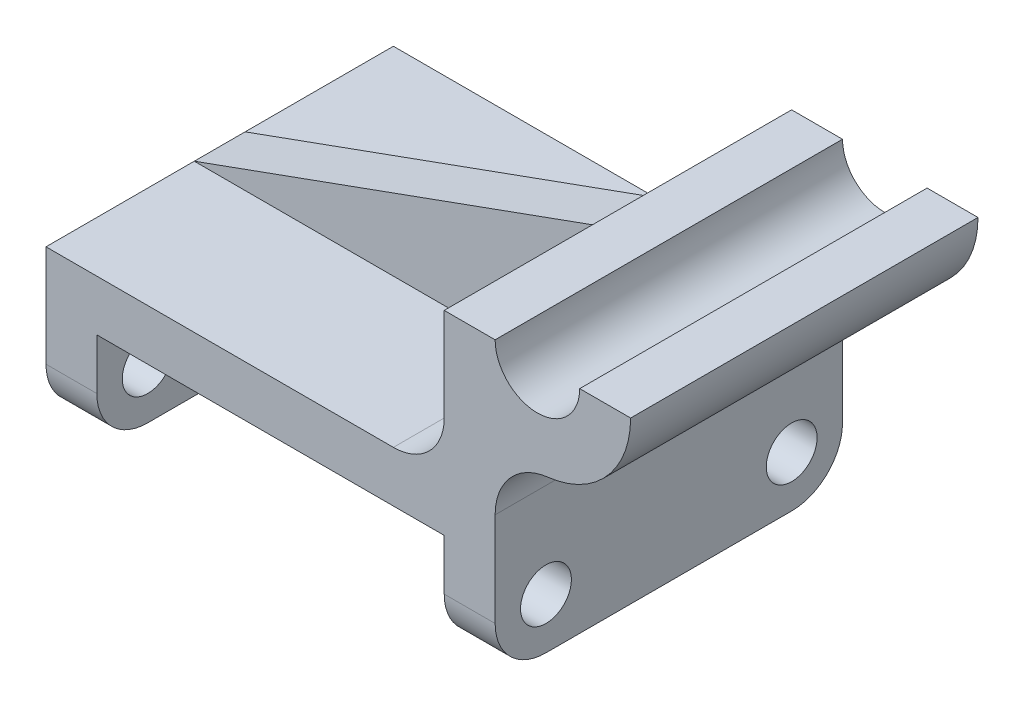
ISO-10303-21;
HEADER;
FILE_DESCRIPTION(('STEP AP214'),'2;1');
FILE_NAME('part.step','',(''),(''),'','','');
FILE_SCHEMA(('AUTOMOTIVE_DESIGN { 1 0 10303 214 1 1 1 1 }'));
ENDSEC;
DATA;
#1=APPLICATION_CONTEXT('core data for automotive mechanical design processes');
#2=APPLICATION_PROTOCOL_DEFINITION('international standard','automotive_design',2000,#1);
#3=PRODUCT_CONTEXT('',#1,'mechanical');
#4=PRODUCT('Part','Part','',(#3));
#5=PRODUCT_RELATED_PRODUCT_CATEGORY('part','',(#4));
#6=PRODUCT_DEFINITION_FORMATION('','',#4);
#7=PRODUCT_DEFINITION_CONTEXT('part definition',#1,'design');
#8=PRODUCT_DEFINITION('design','',#6,#7);
#9=PRODUCT_DEFINITION_SHAPE('','',#8);
#10=(LENGTH_UNIT() NAMED_UNIT(*) SI_UNIT(.MILLI.,.METRE.));
#11=(NAMED_UNIT(*) PLANE_ANGLE_UNIT() SI_UNIT($,.RADIAN.));
#12=(NAMED_UNIT(*) SI_UNIT($,.STERADIAN.) SOLID_ANGLE_UNIT());
#13=UNCERTAINTY_MEASURE_WITH_UNIT(LENGTH_MEASURE(1.E-05),#10,'distance_accuracy_value','');
#14=(GEOMETRIC_REPRESENTATION_CONTEXT(3) GLOBAL_UNCERTAINTY_ASSIGNED_CONTEXT((#13)) GLOBAL_UNIT_ASSIGNED_CONTEXT((#10,
#11,#12)) REPRESENTATION_CONTEXT('',''));
#15=CARTESIAN_POINT('',(0.,0.,0.));
#16=DIRECTION('',(0.,0.,1.));
#17=DIRECTION('',(1.,0.,0.));
#18=AXIS2_PLACEMENT_3D('',#15,#16,#17);
#19=CARTESIAN_POINT('',(15.7865860051617,7.16154123434295,82.));
#20=DIRECTION('',(1.,0.,0.));
#21=DIRECTION('',(0.,0.,-1.));
#22=AXIS2_PLACEMENT_3D('',#19,#20,#21);
#23=PLANE('',#22);
#24=DIRECTION('',(0.,1.,0.));
#25=VECTOR('',#24,1.);
#26=CARTESIAN_POINT('',(15.7865860051617,29.1615412343429,35.));
#27=LINE('',#26,#25);
#28=CARTESIAN_POINT('',(15.7865860051617,7.16154123434295,35.));
#29=VERTEX_POINT('',#28);
#30=CARTESIAN_POINT('',(15.7865860051617,29.1615412343429,35.));
#31=VERTEX_POINT('',#30);
#32=EDGE_CURVE('E417',#29,#31,#27,.T.);
#33=ORIENTED_EDGE('',*,*,#32,.T.);
#34=DIRECTION('',(0.,0.,-1.));
#35=VECTOR('',#34,1.);
#36=CARTESIAN_POINT('',(15.7865860051617,29.1615412343429,82.));
#37=LINE('',#36,#35);
#38=CARTESIAN_POINT('',(15.7865860051617,29.1615412343429,0.));
#39=VERTEX_POINT('',#38);
#40=EDGE_CURVE('E215',#31,#39,#37,.T.);
#41=ORIENTED_EDGE('',*,*,#40,.T.);
#42=DIRECTION('',(0.,-1.,0.));
#43=VECTOR('',#42,1.);
#44=CARTESIAN_POINT('',(15.7865860051617,7.16154123434295,0.));
#45=LINE('',#44,#43);
#46=CARTESIAN_POINT('',(15.7865860051617,7.16154123434295,0.));
#47=VERTEX_POINT('',#46);
#48=EDGE_CURVE('E367',#39,#47,#45,.T.);
#49=ORIENTED_EDGE('',*,*,#48,.T.);
#50=DIRECTION('',(0.,0.,-1.));
#51=VECTOR('',#50,1.);
#52=CARTESIAN_POINT('',(15.7865860051617,7.16154123434295,82.));
#53=LINE('',#52,#51);
#54=EDGE_CURVE('E216',#29,#47,#53,.T.);
#55=ORIENTED_EDGE('',*,*,#54,.F.);
#56=EDGE_LOOP('',(#33,#41,#49,#55));
#57=FACE_BOUND('',#56,.T.);
#58=ADVANCED_FACE('F37',(#57),#23,.F.);
#59=CARTESIAN_POINT('',(3.78658600516171,7.16154123434287,82.));
#60=DIRECTION('',(0.,0.,-1.));
#61=DIRECTION('',(-1.,0.,0.));
#62=AXIS2_PLACEMENT_3D('',#59,#60,#61);
#63=CYLINDRICAL_SURFACE('',#62,12.);
#64=CARTESIAN_POINT('',(3.78658600516171,7.16154123434287,35.));
#65=DIRECTION('',(0.,0.,1.));
#66=DIRECTION('',(1.,0.,0.));
#67=AXIS2_PLACEMENT_3D('',#64,#65,#66);
#68=CIRCLE('',#67,12.);
#69=CARTESIAN_POINT('',(3.78658600516163,-4.83845876565713,35.));
#70=VERTEX_POINT('',#69);
#71=EDGE_CURVE('E414',#70,#29,#68,.T.);
#72=ORIENTED_EDGE('',*,*,#71,.T.);
#73=ORIENTED_EDGE('',*,*,#54,.T.);
#74=CARTESIAN_POINT('',(3.78658600516171,7.16154123434287,0.));
#75=DIRECTION('',(0.,0.,-1.));
#76=DIRECTION('',(-1.,0.,0.));
#77=AXIS2_PLACEMENT_3D('',#74,#75,#76);
#78=CIRCLE('',#77,12.);
#79=CARTESIAN_POINT('',(3.78658600516163,-4.83845876565713,0.));
#80=VERTEX_POINT('',#79);
#81=EDGE_CURVE('E370',#47,#80,#78,.T.);
#82=ORIENTED_EDGE('',*,*,#81,.T.);
#83=DIRECTION('',(0.,0.,-1.));
#84=VECTOR('',#83,1.);
#85=CARTESIAN_POINT('',(3.78658600516163,-4.83845876565713,82.));
#86=LINE('',#85,#84);
#87=EDGE_CURVE('E376',#70,#80,#86,.T.);
#88=ORIENTED_EDGE('',*,*,#87,.F.);
#89=EDGE_LOOP('',(#72,#73,#82,#88));
#90=FACE_BOUND('',#89,.T.);
#91=ADVANCED_FACE('F441',(#90),#63,.F.);
#92=CARTESIAN_POINT('',(-78.2134139948383,-4.83845876565713,82.));
#93=DIRECTION('',(0.,-1.,0.));
#94=DIRECTION('',(0.,0.,-1.));
#95=AXIS2_PLACEMENT_3D('',#92,#93,#94);
#96=PLANE('',#95);
#97=DIRECTION('',(1.,0.,0.));
#98=VECTOR('',#97,1.);
#99=CARTESIAN_POINT('',(3.78658600516163,-4.83845876565713,35.));
#100=LINE('',#99,#98);
#101=CARTESIAN_POINT('',(-78.2134139948383,-4.83845876565713,35.));
#102=VERTEX_POINT('',#101);
#103=EDGE_CURVE('E425',#102,#70,#100,.T.);
#104=ORIENTED_EDGE('',*,*,#103,.T.);
#105=ORIENTED_EDGE('',*,*,#87,.T.);
#106=DIRECTION('',(-1.,0.,0.));
#107=VECTOR('',#106,1.);
#108=CARTESIAN_POINT('',(-78.2134139948383,-4.83845876565713,0.));
#109=LINE('',#108,#107);
#110=CARTESIAN_POINT('',(-78.2134139948383,-4.83845876565713,0.));
#111=VERTEX_POINT('',#110);
#112=EDGE_CURVE('E321',#80,#111,#109,.T.);
#113=ORIENTED_EDGE('',*,*,#112,.T.);
#114=DIRECTION('',(0.,0.,-1.));
#115=VECTOR('',#114,1.);
#116=CARTESIAN_POINT('',(-78.2134139948383,-4.83845876565713,82.));
#117=LINE('',#116,#115);
#118=EDGE_CURVE('E345',#102,#111,#117,.T.);
#119=ORIENTED_EDGE('',*,*,#118,.F.);
#120=EDGE_LOOP('',(#104,#105,#113,#119));
#121=FACE_BOUND('',#120,.T.);
#122=ADVANCED_FACE('F386',(#121),#96,.F.);
#123=CARTESIAN_POINT('',(-78.2134139948383,-40.8384587656571,82.));
#124=DIRECTION('',(1.,0.,0.));
#125=DIRECTION('',(0.,0.,-1.));
#126=AXIS2_PLACEMENT_3D('',#123,#124,#125);
#127=PLANE('',#126);
#128=CARTESIAN_POINT('',(-78.2134139948383,-28.8384587656571,12.));
#129=DIRECTION('',(-1.,0.,0.));
#130=DIRECTION('',(0.,0.,1.));
#131=AXIS2_PLACEMENT_3D('',#128,#129,#130);
#132=CIRCLE('',#131,6.);
#133=CARTESIAN_POINT('',(-78.2134139948383,-28.8384587656571,18.));
#134=VERTEX_POINT('',#133);
#135=EDGE_CURVE('E290',#134,#134,#132,.T.);
#136=ORIENTED_EDGE('',*,*,#135,.F.);
#137=EDGE_LOOP('',(#136));
#138=FACE_BOUND('',#137,.T.);
#139=CARTESIAN_POINT('',(-78.2134139948383,-28.8384587656571,70.));
#140=DIRECTION('',(-1.,0.,0.));
#141=DIRECTION('',(0.,0.,1.));
#142=AXIS2_PLACEMENT_3D('',#139,#140,#141);
#143=CIRCLE('',#142,6.);
#144=CARTESIAN_POINT('',(-78.2134139948383,-28.8384587656571,76.));
#145=VERTEX_POINT('',#144);
#146=EDGE_CURVE('E297',#145,#145,#143,.T.);
#147=ORIENTED_EDGE('',*,*,#146,.F.);
#148=EDGE_LOOP('',(#147));
#149=FACE_BOUND('',#148,.T.);
#150=DIRECTION('',(0.,-1.,0.));
#151=VECTOR('',#150,1.);
#152=CARTESIAN_POINT('',(-78.2134139948383,-40.8384587656571,0.));
#153=LINE('',#152,#151);
#154=CARTESIAN_POINT('',(-78.2134139948383,-28.8384587656571,0.));
#155=VERTEX_POINT('',#154);
#156=EDGE_CURVE('E316',#111,#155,#153,.T.);
#157=ORIENTED_EDGE('',*,*,#156,.T.);
#158=CARTESIAN_POINT('',(-78.2134139948383,-28.8384587656571,12.));
#159=DIRECTION('',(1.,0.,0.));
#160=DIRECTION('',(0.,0.,-1.));
#161=AXIS2_PLACEMENT_3D('',#158,#159,#160);
#162=CIRCLE('',#161,12.);
#163=CARTESIAN_POINT('',(-78.2134139948383,-40.8384587656571,12.));
#164=VERTEX_POINT('',#163);
#165=EDGE_CURVE('E11',#155,#164,#162,.F.);
#166=ORIENTED_EDGE('',*,*,#165,.T.);
#167=DIRECTION('',(0.,0.,-1.));
#168=VECTOR('',#167,1.);
#169=CARTESIAN_POINT('',(-78.2134139948383,-40.8384587656571,82.));
#170=LINE('',#169,#168);
#171=CARTESIAN_POINT('',(-78.2134139948383,-40.8384587656571,70.));
#172=VERTEX_POINT('',#171);
#173=EDGE_CURVE('E253',#172,#164,#170,.T.);
#174=ORIENTED_EDGE('',*,*,#173,.F.);
#175=CARTESIAN_POINT('',(-78.2134139948383,-28.8384587656571,70.));
#176=DIRECTION('',(1.,0.,0.));
#177=DIRECTION('',(0.,0.,-1.));
#178=AXIS2_PLACEMENT_3D('',#175,#176,#177);
#179=CIRCLE('',#178,12.);
#180=CARTESIAN_POINT('',(-78.2134139948383,-28.8384587656571,82.));
#181=VERTEX_POINT('',#180);
#182=EDGE_CURVE('E46',#172,#181,#179,.F.);
#183=ORIENTED_EDGE('',*,*,#182,.T.);
#184=DIRECTION('',(0.,-1.,0.));
#185=VECTOR('',#184,1.);
#186=CARTESIAN_POINT('',(-78.2134139948383,-40.8384587656571,82.));
#187=LINE('',#186,#185);
#188=CARTESIAN_POINT('',(-78.2134139948383,-4.83845876565713,82.));
#189=VERTEX_POINT('',#188);
#190=EDGE_CURVE('E317',#189,#181,#187,.T.);
#191=ORIENTED_EDGE('',*,*,#190,.F.);
#192=CARTESIAN_POINT('',(-78.2134139948383,-4.83845876565713,47.));
#193=VERTEX_POINT('',#192);
#194=EDGE_CURVE('E374',#189,#193,#117,.T.);
#195=ORIENTED_EDGE('',*,*,#194,.T.);
#196=DIRECTION('',(0.,0.,1.));
#197=VECTOR('',#196,1.);
#198=CARTESIAN_POINT('',(-78.2134139948383,-4.83845876565713,35.));
#199=LINE('',#198,#197);
#200=EDGE_CURVE('E302',#102,#193,#199,.T.);
#201=ORIENTED_EDGE('',*,*,#200,.F.);
#202=ORIENTED_EDGE('',*,*,#118,.T.);
#203=EDGE_LOOP('',(#157,#166,#174,#183,#191,#195,#201,#202));
#204=FACE_BOUND('',#203,.T.);
#205=ADVANCED_FACE('F381',(#138,#149,#204),#127,.F.);
#206=CARTESIAN_POINT('',(-78.2134139948383,-40.8384587656571,82.));
#207=DIRECTION('',(0.,1.,0.));
#208=DIRECTION('',(0.,0.,1.));
#209=AXIS2_PLACEMENT_3D('',#206,#207,#208);
#210=PLANE('',#209);
#211=ORIENTED_EDGE('',*,*,#173,.T.);
#212=DIRECTION('',(1.,0.,0.));
#213=VECTOR('',#212,1.);
#214=CARTESIAN_POINT('',(-66.2134139948383,-40.8384587656571,12.));
#215=LINE('',#214,#213);
#216=CARTESIAN_POINT('',(-66.2134139948383,-40.8384587656571,12.));
#217=VERTEX_POINT('',#216);
#218=EDGE_CURVE('E280',#164,#217,#215,.T.);
#219=ORIENTED_EDGE('',*,*,#218,.T.);
#220=DIRECTION('',(0.,0.,-1.));
#221=VECTOR('',#220,1.);
#222=CARTESIAN_POINT('',(-66.2134139948383,-40.8384587656571,82.));
#223=LINE('',#222,#221);
#224=CARTESIAN_POINT('',(-66.2134139948383,-40.8384587656571,70.));
#225=VERTEX_POINT('',#224);
#226=EDGE_CURVE('E250',#225,#217,#223,.T.);
#227=ORIENTED_EDGE('',*,*,#226,.F.);
#228=DIRECTION('',(1.,0.,0.));
#229=VECTOR('',#228,1.);
#230=CARTESIAN_POINT('',(-78.2134139948383,-40.8384587656571,70.));
#231=LINE('',#230,#229);
#232=EDGE_CURVE('E278',#225,#172,#231,.F.);
#233=ORIENTED_EDGE('',*,*,#232,.T.);
#234=EDGE_LOOP('',(#211,#219,#227,#233));
#235=FACE_BOUND('',#234,.T.);
#236=ADVANCED_FACE('F400',(#235),#210,.F.);
#237=CARTESIAN_POINT('',(-66.2134139948383,-40.8384587656571,82.));
#238=DIRECTION('',(-1.,0.,0.));
#239=DIRECTION('',(0.,0.,1.));
#240=AXIS2_PLACEMENT_3D('',#237,#238,#239);
#241=PLANE('',#240);
#242=CARTESIAN_POINT('',(-66.2134139948383,-28.8384587656571,12.));
#243=DIRECTION('',(-1.,0.,0.));
#244=DIRECTION('',(0.,0.,1.));
#245=AXIS2_PLACEMENT_3D('',#242,#243,#244);
#246=CIRCLE('',#245,6.);
#247=CARTESIAN_POINT('',(-66.2134139948383,-28.8384587656571,18.));
#248=VERTEX_POINT('',#247);
#249=EDGE_CURVE('E313',#248,#248,#246,.T.);
#250=ORIENTED_EDGE('',*,*,#249,.T.);
#251=EDGE_LOOP('',(#250));
#252=FACE_BOUND('',#251,.T.);
#253=CARTESIAN_POINT('',(-66.2134139948383,-28.8384587656571,70.));
#254=DIRECTION('',(-1.,0.,0.));
#255=DIRECTION('',(0.,0.,1.));
#256=AXIS2_PLACEMENT_3D('',#253,#254,#255);
#257=CIRCLE('',#256,6.);
#258=CARTESIAN_POINT('',(-66.2134139948383,-28.8384587656571,76.));
#259=VERTEX_POINT('',#258);
#260=EDGE_CURVE('E294',#259,#259,#257,.T.);
#261=ORIENTED_EDGE('',*,*,#260,.T.);
#262=EDGE_LOOP('',(#261));
#263=FACE_BOUND('',#262,.T.);
#264=ORIENTED_EDGE('',*,*,#226,.T.);
#265=CARTESIAN_POINT('',(-66.2134139948383,-28.8384587656571,12.));
#266=DIRECTION('',(-1.,0.,0.));
#267=DIRECTION('',(0.,0.,1.));
#268=AXIS2_PLACEMENT_3D('',#265,#266,#267);
#269=CIRCLE('',#268,12.);
#270=CARTESIAN_POINT('',(-66.2134139948383,-28.8384587656571,0.));
#271=VERTEX_POINT('',#270);
#272=EDGE_CURVE('E285',#217,#271,#269,.F.);
#273=ORIENTED_EDGE('',*,*,#272,.T.);
#274=DIRECTION('',(0.,1.,0.));
#275=VECTOR('',#274,1.);
#276=CARTESIAN_POINT('',(-66.2134139948383,-40.8384587656571,0.));
#277=LINE('',#276,#275);
#278=CARTESIAN_POINT('',(-66.2134139948383,-16.8384587656571,0.));
#279=VERTEX_POINT('',#278);
#280=EDGE_CURVE('E347',#271,#279,#277,.T.);
#281=ORIENTED_EDGE('',*,*,#280,.T.);
#282=DIRECTION('',(0.,0.,-1.));
#283=VECTOR('',#282,1.);
#284=CARTESIAN_POINT('',(-66.2134139948383,-16.8384587656571,82.));
#285=LINE('',#284,#283);
#286=CARTESIAN_POINT('',(-66.2134139948383,-16.8384587656571,82.));
#287=VERTEX_POINT('',#286);
#288=EDGE_CURVE('E247',#287,#279,#285,.T.);
#289=ORIENTED_EDGE('',*,*,#288,.F.);
#290=DIRECTION('',(0.,1.,0.));
#291=VECTOR('',#290,1.);
#292=CARTESIAN_POINT('',(-66.2134139948383,-40.8384587656571,82.));
#293=LINE('',#292,#291);
#294=CARTESIAN_POINT('',(-66.2134139948383,-28.8384587656571,82.));
#295=VERTEX_POINT('',#294);
#296=EDGE_CURVE('E320',#295,#287,#293,.T.);
#297=ORIENTED_EDGE('',*,*,#296,.F.);
#298=CARTESIAN_POINT('',(-66.2134139948383,-28.8384587656571,70.));
#299=DIRECTION('',(-1.,0.,0.));
#300=DIRECTION('',(0.,0.,1.));
#301=AXIS2_PLACEMENT_3D('',#298,#299,#300);
#302=CIRCLE('',#301,12.);
#303=EDGE_CURVE('E283',#295,#225,#302,.F.);
#304=ORIENTED_EDGE('',*,*,#303,.T.);
#305=EDGE_LOOP('',(#264,#273,#281,#289,#297,#304));
#306=FACE_BOUND('',#305,.T.);
#307=ADVANCED_FACE('F403',(#252,#263,#306),#241,.F.);
#308=CARTESIAN_POINT('',(-66.2134139948383,-16.8384587656571,82.));
#309=DIRECTION('',(0.,1.,0.));
#310=DIRECTION('',(0.,0.,1.));
#311=AXIS2_PLACEMENT_3D('',#308,#309,#310);
#312=PLANE('',#311);
#313=DIRECTION('',(1.,0.,0.));
#314=VECTOR('',#313,1.);
#315=CARTESIAN_POINT('',(-66.2134139948383,-16.8384587656571,0.));
#316=LINE('',#315,#314);
#317=CARTESIAN_POINT('',(15.7865860051617,-16.8384587656571,0.));
#318=VERTEX_POINT('',#317);
#319=EDGE_CURVE('E349',#279,#318,#316,.T.);
#320=ORIENTED_EDGE('',*,*,#319,.T.);
#321=DIRECTION('',(0.,0.,-1.));
#322=VECTOR('',#321,1.);
#323=CARTESIAN_POINT('',(15.7865860051617,-16.8384587656571,82.));
#324=LINE('',#323,#322);
#325=CARTESIAN_POINT('',(15.7865860051617,-16.8384587656571,82.));
#326=VERTEX_POINT('',#325);
#327=EDGE_CURVE('E244',#326,#318,#324,.T.);
#328=ORIENTED_EDGE('',*,*,#327,.F.);
#329=DIRECTION('',(1.,0.,0.));
#330=VECTOR('',#329,1.);
#331=CARTESIAN_POINT('',(-66.2134139948383,-16.8384587656571,82.));
#332=LINE('',#331,#330);
#333=EDGE_CURVE('E323',#287,#326,#332,.T.);
#334=ORIENTED_EDGE('',*,*,#333,.F.);
#335=ORIENTED_EDGE('',*,*,#288,.T.);
#336=EDGE_LOOP('',(#320,#328,#334,#335));
#337=FACE_BOUND('',#336,.T.);
#338=ADVANCED_FACE('F488',(#337),#312,.F.);
#339=CARTESIAN_POINT('',(15.7865860051617,-16.8384587656571,82.));
#340=DIRECTION('',(1.,0.,0.));
#341=DIRECTION('',(0.,0.,-1.));
#342=AXIS2_PLACEMENT_3D('',#339,#340,#341);
#343=PLANE('',#342);
#344=CARTESIAN_POINT('',(15.7865860051617,-28.8384587656571,12.));
#345=DIRECTION('',(1.,0.,0.));
#346=DIRECTION('',(0.,0.,-1.));
#347=AXIS2_PLACEMENT_3D('',#344,#345,#346);
#348=CIRCLE('',#347,6.);
#349=CARTESIAN_POINT('',(15.7865860051617,-28.8384587656571,6.));
#350=VERTEX_POINT('',#349);
#351=EDGE_CURVE('E310',#350,#350,#348,.T.);
#352=ORIENTED_EDGE('',*,*,#351,.T.);
#353=EDGE_LOOP('',(#352));
#354=FACE_BOUND('',#353,.T.);
#355=CARTESIAN_POINT('',(15.7865860051617,-28.8384587656571,70.));
#356=DIRECTION('',(1.,0.,0.));
#357=DIRECTION('',(0.,0.,-1.));
#358=AXIS2_PLACEMENT_3D('',#355,#356,#357);
#359=CIRCLE('',#358,6.);
#360=CARTESIAN_POINT('',(15.7865860051617,-28.8384587656571,64.));
#361=VERTEX_POINT('',#360);
#362=EDGE_CURVE('E289',#361,#361,#359,.T.);
#363=ORIENTED_EDGE('',*,*,#362,.T.);
#364=EDGE_LOOP('',(#363));
#365=FACE_BOUND('',#364,.T.);
#366=DIRECTION('',(0.,0.,-1.));
#367=VECTOR('',#366,1.);
#368=CARTESIAN_POINT('',(15.7865860051617,-40.8384587656571,82.));
#369=LINE('',#368,#367);
#370=CARTESIAN_POINT('',(15.7865860051617,-40.8384587656571,70.));
#371=VERTEX_POINT('',#370);
#372=CARTESIAN_POINT('',(15.7865860051617,-40.8384587656571,12.));
#373=VERTEX_POINT('',#372);
#374=EDGE_CURVE('E241',#371,#373,#369,.T.);
#375=ORIENTED_EDGE('',*,*,#374,.F.);
#376=CARTESIAN_POINT('',(15.7865860051617,-28.8384587656571,70.));
#377=DIRECTION('',(1.,0.,0.));
#378=DIRECTION('',(0.,0.,-1.));
#379=AXIS2_PLACEMENT_3D('',#376,#377,#378);
#380=CIRCLE('',#379,12.);
#381=CARTESIAN_POINT('',(15.7865860051617,-28.8384587656571,82.));
#382=VERTEX_POINT('',#381);
#383=EDGE_CURVE('E272',#371,#382,#380,.F.);
#384=ORIENTED_EDGE('',*,*,#383,.T.);
#385=DIRECTION('',(0.,-1.,0.));
#386=VECTOR('',#385,1.);
#387=CARTESIAN_POINT('',(15.7865860051617,-16.8384587656571,82.));
#388=LINE('',#387,#386);
#389=EDGE_CURVE('E325',#326,#382,#388,.T.);
#390=ORIENTED_EDGE('',*,*,#389,.F.);
#391=ORIENTED_EDGE('',*,*,#327,.T.);
#392=DIRECTION('',(0.,-1.,0.));
#393=VECTOR('',#392,1.);
#394=CARTESIAN_POINT('',(15.7865860051617,-16.8384587656571,0.));
#395=LINE('',#394,#393);
#396=CARTESIAN_POINT('',(15.7865860051617,-28.8384587656571,0.));
#397=VERTEX_POINT('',#396);
#398=EDGE_CURVE('E351',#318,#397,#395,.T.);
#399=ORIENTED_EDGE('',*,*,#398,.T.);
#400=CARTESIAN_POINT('',(15.7865860051617,-28.8384587656571,12.));
#401=DIRECTION('',(1.,0.,0.));
#402=DIRECTION('',(0.,0.,-1.));
#403=AXIS2_PLACEMENT_3D('',#400,#401,#402);
#404=CIRCLE('',#403,12.);
#405=EDGE_CURVE('E270',#397,#373,#404,.F.);
#406=ORIENTED_EDGE('',*,*,#405,.T.);
#407=EDGE_LOOP('',(#375,#384,#390,#391,#399,#406));
#408=FACE_BOUND('',#407,.T.);
#409=ADVANCED_FACE('F475',(#354,#365,#408),#343,.F.);
#410=CARTESIAN_POINT('',(15.7865860051617,-40.8384587656571,82.));
#411=DIRECTION('',(0.,1.,0.));
#412=DIRECTION('',(0.,0.,1.));
#413=AXIS2_PLACEMENT_3D('',#410,#411,#412);
#414=PLANE('',#413);
#415=DIRECTION('',(0.,0.,-1.));
#416=VECTOR('',#415,1.);
#417=CARTESIAN_POINT('',(27.8049203277725,-40.8384587656571,82.));
#418=LINE('',#417,#416);
#419=CARTESIAN_POINT('',(27.8049203277725,-40.8384587656571,70.));
#420=VERTEX_POINT('',#419);
#421=CARTESIAN_POINT('',(27.8049203277725,-40.8384587656571,12.));
#422=VERTEX_POINT('',#421);
#423=EDGE_CURVE('E238',#420,#422,#418,.T.);
#424=ORIENTED_EDGE('',*,*,#423,.F.);
#425=DIRECTION('',(1.,0.,0.));
#426=VECTOR('',#425,1.);
#427=CARTESIAN_POINT('',(15.7865860051617,-40.8384587656571,70.));
#428=LINE('',#427,#426);
#429=EDGE_CURVE('E268',#420,#371,#428,.F.);
#430=ORIENTED_EDGE('',*,*,#429,.T.);
#431=ORIENTED_EDGE('',*,*,#374,.T.);
#432=DIRECTION('',(1.,0.,0.));
#433=VECTOR('',#432,1.);
#434=CARTESIAN_POINT('',(27.8049203277725,-40.8384587656571,12.));
#435=LINE('',#434,#433);
#436=EDGE_CURVE('E265',#373,#422,#435,.T.);
#437=ORIENTED_EDGE('',*,*,#436,.T.);
#438=EDGE_LOOP('',(#424,#430,#431,#437));
#439=FACE_BOUND('',#438,.T.);
#440=ADVANCED_FACE('F479',(#439),#414,.F.);
#441=CARTESIAN_POINT('',(27.8049203277725,-40.8384587656571,82.));
#442=DIRECTION('',(-1.,0.,0.));
#443=DIRECTION('',(0.,0.,1.));
#444=AXIS2_PLACEMENT_3D('',#441,#442,#443);
#445=PLANE('',#444);
#446=CARTESIAN_POINT('',(27.8049203277725,-28.8384587656571,12.));
#447=DIRECTION('',(-1.,0.,0.));
#448=DIRECTION('',(0.,0.,1.));
#449=AXIS2_PLACEMENT_3D('',#446,#447,#448);
#450=CIRCLE('',#449,6.);
#451=CARTESIAN_POINT('',(27.8049203277725,-28.8384587656571,18.));
#452=VERTEX_POINT('',#451);
#453=EDGE_CURVE('E41',#452,#452,#450,.T.);
#454=ORIENTED_EDGE('',*,*,#453,.T.);
#455=EDGE_LOOP('',(#454));
#456=FACE_BOUND('',#455,.T.);
#457=CARTESIAN_POINT('',(27.8049203277725,-28.8384587656571,70.));
#458=DIRECTION('',(-1.,0.,0.));
#459=DIRECTION('',(0.,0.,1.));
#460=AXIS2_PLACEMENT_3D('',#457,#458,#459);
#461=CIRCLE('',#460,6.);
#462=CARTESIAN_POINT('',(27.8049203277725,-28.8384587656571,76.));
#463=VERTEX_POINT('',#462);
#464=EDGE_CURVE('E287',#463,#463,#461,.T.);
#465=ORIENTED_EDGE('',*,*,#464,.T.);
#466=EDGE_LOOP('',(#465));
#467=FACE_BOUND('',#466,.T.);
#468=DIRECTION('',(0.,1.,0.));
#469=VECTOR('',#468,1.);
#470=CARTESIAN_POINT('',(27.8049203277725,-40.8384587656571,82.));
#471=LINE('',#470,#469);
#472=CARTESIAN_POINT('',(27.8049203277725,-28.8384587656571,82.));
#473=VERTEX_POINT('',#472);
#474=CARTESIAN_POINT('',(27.8049203277725,-6.61349180927188,82.));
#475=VERTEX_POINT('',#474);
#476=EDGE_CURVE('E328',#473,#475,#471,.T.);
#477=ORIENTED_EDGE('',*,*,#476,.F.);
#478=CARTESIAN_POINT('',(27.8049203277725,-28.8384587656571,70.));
#479=DIRECTION('',(-1.,0.,0.));
#480=DIRECTION('',(0.,0.,1.));
#481=AXIS2_PLACEMENT_3D('',#478,#479,#480);
#482=CIRCLE('',#481,12.);
#483=EDGE_CURVE('E263',#473,#420,#482,.F.);
#484=ORIENTED_EDGE('',*,*,#483,.T.);
#485=ORIENTED_EDGE('',*,*,#423,.T.);
#486=CARTESIAN_POINT('',(27.8049203277725,-28.8384587656571,12.));
#487=DIRECTION('',(-1.,0.,0.));
#488=DIRECTION('',(0.,0.,1.));
#489=AXIS2_PLACEMENT_3D('',#486,#487,#488);
#490=CIRCLE('',#489,12.);
#491=CARTESIAN_POINT('',(27.8049203277725,-28.8384587656571,0.));
#492=VERTEX_POINT('',#491);
#493=EDGE_CURVE('E261',#422,#492,#490,.F.);
#494=ORIENTED_EDGE('',*,*,#493,.T.);
#495=DIRECTION('',(0.,1.,0.));
#496=VECTOR('',#495,1.);
#497=CARTESIAN_POINT('',(27.8049203277725,-40.8384587656571,0.));
#498=LINE('',#497,#496);
#499=CARTESIAN_POINT('',(27.8049203277725,-6.61349180927188,0.));
#500=VERTEX_POINT('',#499);
#501=EDGE_CURVE('E354',#492,#500,#498,.T.);
#502=ORIENTED_EDGE('',*,*,#501,.T.);
#503=DIRECTION('',(0.,0.,-1.));
#504=VECTOR('',#503,1.);
#505=CARTESIAN_POINT('',(27.8049203277725,-6.61349180927188,82.));
#506=LINE('',#505,#504);
#507=EDGE_CURVE('E235',#475,#500,#506,.T.);
#508=ORIENTED_EDGE('',*,*,#507,.F.);
#509=EDGE_LOOP('',(#477,#484,#485,#494,#502,#508));
#510=FACE_BOUND('',#509,.T.);
#511=ADVANCED_FACE('F466',(#456,#467,#510),#445,.F.);
#512=CARTESIAN_POINT('',(41.8049203277725,-6.61349180927188,82.));
#513=DIRECTION('',(0.,0.,-1.));
#514=DIRECTION('',(-1.,0.,0.));
#515=AXIS2_PLACEMENT_3D('',#512,#513,#514);
#516=CYLINDRICAL_SURFACE('',#515,14.);
#517=CARTESIAN_POINT('',(41.8049203277725,-6.61349180927188,0.));
#518=DIRECTION('',(0.,0.,-1.));
#519=DIRECTION('',(1.,0.,0.));
#520=AXIS2_PLACEMENT_3D('',#517,#518,#519);
#521=CIRCLE('',#520,14.);
#522=CARTESIAN_POINT('',(40.2422347578683,7.29902104102274,0.));
#523=VERTEX_POINT('',#522);
#524=EDGE_CURVE('E356',#500,#523,#521,.T.);
#525=ORIENTED_EDGE('',*,*,#524,.T.);
#526=DIRECTION('',(0.,0.,-1.));
#527=VECTOR('',#526,1.);
#528=CARTESIAN_POINT('',(40.2422347578683,7.29902104102274,82.));
#529=LINE('',#528,#527);
#530=CARTESIAN_POINT('',(40.2422347578683,7.29902104102274,82.));
#531=VERTEX_POINT('',#530);
#532=EDGE_CURVE('E232',#531,#523,#529,.T.);
#533=ORIENTED_EDGE('',*,*,#532,.F.);
#534=CARTESIAN_POINT('',(41.8049203277725,-6.61349180927188,82.));
#535=DIRECTION('',(0.,0.,-1.));
#536=DIRECTION('',(1.,0.,0.));
#537=AXIS2_PLACEMENT_3D('',#534,#535,#536);
#538=CIRCLE('',#537,14.);
#539=EDGE_CURVE('E330',#475,#531,#538,.T.);
#540=ORIENTED_EDGE('',*,*,#539,.F.);
#541=ORIENTED_EDGE('',*,*,#507,.T.);
#542=EDGE_LOOP('',(#525,#533,#540,#541));
#543=FACE_BOUND('',#542,.T.);
#544=ADVANCED_FACE('F462',(#543),#516,.F.);
#545=CARTESIAN_POINT('',(37.7865860051617,29.1615412343429,82.));
#546=DIRECTION('',(0.,0.,-1.));
#547=DIRECTION('',(-1.,0.,0.));
#548=AXIS2_PLACEMENT_3D('',#545,#546,#547);
#549=CYLINDRICAL_SURFACE('',#548,22.);
#550=CARTESIAN_POINT('',(37.7865860051617,29.1615412343429,0.));
#551=DIRECTION('',(0.,0.,1.));
#552=DIRECTION('',(1.,0.,0.));
#553=AXIS2_PLACEMENT_3D('',#550,#551,#552);
#554=CIRCLE('',#553,22.);
#555=CARTESIAN_POINT('',(59.7865860051617,29.1615412343429,0.));
#556=VERTEX_POINT('',#555);
#557=EDGE_CURVE('E358',#523,#556,#554,.T.);
#558=ORIENTED_EDGE('',*,*,#557,.T.);
#559=DIRECTION('',(0.,0.,-1.));
#560=VECTOR('',#559,1.);
#561=CARTESIAN_POINT('',(59.7865860051617,29.1615412343429,82.));
#562=LINE('',#561,#560);
#563=CARTESIAN_POINT('',(59.7865860051617,29.1615412343429,82.));
#564=VERTEX_POINT('',#563);
#565=EDGE_CURVE('E229',#564,#556,#562,.T.);
#566=ORIENTED_EDGE('',*,*,#565,.F.);
#567=CARTESIAN_POINT('',(37.7865860051617,29.1615412343429,82.));
#568=DIRECTION('',(0.,0.,1.));
#569=DIRECTION('',(1.,0.,0.));
#570=AXIS2_PLACEMENT_3D('',#567,#568,#569);
#571=CIRCLE('',#570,22.);
#572=EDGE_CURVE('E332',#531,#564,#571,.T.);
#573=ORIENTED_EDGE('',*,*,#572,.F.);
#574=ORIENTED_EDGE('',*,*,#532,.T.);
#575=EDGE_LOOP('',(#558,#566,#573,#574));
#576=FACE_BOUND('',#575,.T.);
#577=ADVANCED_FACE('F457',(#576),#549,.T.);
#578=CARTESIAN_POINT('',(47.7682516825509,29.1615412343429,82.));
#579=DIRECTION('',(0.,-1.,0.));
#580=DIRECTION('',(0.,0.,-1.));
#581=AXIS2_PLACEMENT_3D('',#578,#579,#580);
#582=PLANE('',#581);
#583=DIRECTION('',(-1.,0.,0.));
#584=VECTOR('',#583,1.);
#585=CARTESIAN_POINT('',(47.7682516825509,29.1615412343429,0.));
#586=LINE('',#585,#584);
#587=CARTESIAN_POINT('',(47.7682516825509,29.1615412343429,0.));
#588=VERTEX_POINT('',#587);
#589=EDGE_CURVE('E360',#556,#588,#586,.T.);
#590=ORIENTED_EDGE('',*,*,#589,.T.);
#591=DIRECTION('',(0.,0.,-1.));
#592=VECTOR('',#591,1.);
#593=CARTESIAN_POINT('',(47.7682516825509,29.1615412343429,82.));
#594=LINE('',#593,#592);
#595=CARTESIAN_POINT('',(47.7682516825509,29.1615412343429,82.));
#596=VERTEX_POINT('',#595);
#597=EDGE_CURVE('E226',#596,#588,#594,.T.);
#598=ORIENTED_EDGE('',*,*,#597,.F.);
#599=DIRECTION('',(-1.,0.,0.));
#600=VECTOR('',#599,1.);
#601=CARTESIAN_POINT('',(47.7682516825509,29.1615412343429,82.));
#602=LINE('',#601,#600);
#603=EDGE_CURVE('E334',#564,#596,#602,.T.);
#604=ORIENTED_EDGE('',*,*,#603,.F.);
#605=ORIENTED_EDGE('',*,*,#565,.T.);
#606=EDGE_LOOP('',(#590,#598,#604,#605));
#607=FACE_BOUND('',#606,.T.);
#608=ADVANCED_FACE('F452',(#607),#582,.F.);
#609=CARTESIAN_POINT('',(37.7865860051617,29.1615412343429,82.));
#610=DIRECTION('',(0.,0.,-1.));
#611=DIRECTION('',(-1.,0.,0.));
#612=AXIS2_PLACEMENT_3D('',#609,#610,#611);
#613=CYLINDRICAL_SURFACE('',#612,9.98166567738922);
#614=CARTESIAN_POINT('',(37.7865860051617,29.1615412343429,0.));
#615=DIRECTION('',(0.,0.,-1.));
#616=DIRECTION('',(1.,0.,0.));
#617=AXIS2_PLACEMENT_3D('',#614,#615,#616);
#618=CIRCLE('',#617,9.98166567738922);
#619=CARTESIAN_POINT('',(27.8049203277725,29.1615412343429,0.));
#620=VERTEX_POINT('',#619);
#621=EDGE_CURVE('E362',#588,#620,#618,.T.);
#622=ORIENTED_EDGE('',*,*,#621,.T.);
#623=DIRECTION('',(0.,0.,-1.));
#624=VECTOR('',#623,1.);
#625=CARTESIAN_POINT('',(27.8049203277725,29.1615412343429,82.));
#626=LINE('',#625,#624);
#627=CARTESIAN_POINT('',(27.8049203277725,29.1615412343429,82.));
#628=VERTEX_POINT('',#627);
#629=EDGE_CURVE('E223',#628,#620,#626,.T.);
#630=ORIENTED_EDGE('',*,*,#629,.F.);
#631=CARTESIAN_POINT('',(37.7865860051617,29.1615412343429,82.));
#632=DIRECTION('',(0.,0.,-1.));
#633=DIRECTION('',(1.,0.,0.));
#634=AXIS2_PLACEMENT_3D('',#631,#632,#633);
#635=CIRCLE('',#634,9.98166567738922);
#636=EDGE_CURVE('E336',#596,#628,#635,.T.);
#637=ORIENTED_EDGE('',*,*,#636,.F.);
#638=ORIENTED_EDGE('',*,*,#597,.T.);
#639=EDGE_LOOP('',(#622,#630,#637,#638));
#640=FACE_BOUND('',#639,.T.);
#641=ADVANCED_FACE('F448',(#640),#613,.F.);
#642=CARTESIAN_POINT('',(27.8049203277725,29.1615412343429,82.));
#643=DIRECTION('',(0.,-1.,0.));
#644=DIRECTION('',(0.,0.,-1.));
#645=AXIS2_PLACEMENT_3D('',#642,#643,#644);
#646=PLANE('',#645);
#647=DIRECTION('',(-1.,0.,0.));
#648=VECTOR('',#647,1.);
#649=CARTESIAN_POINT('',(27.8049203277725,29.1615412343429,0.));
#650=LINE('',#649,#648);
#651=EDGE_CURVE('E364',#620,#39,#650,.T.);
#652=ORIENTED_EDGE('',*,*,#651,.T.);
#653=ORIENTED_EDGE('',*,*,#40,.F.);
#654=DIRECTION('',(0.,0.,1.));
#655=VECTOR('',#654,1.);
#656=CARTESIAN_POINT('',(15.7865860051617,29.1615412343429,35.));
#657=LINE('',#656,#655);
#658=CARTESIAN_POINT('',(15.7865860051617,29.1615412343429,47.));
#659=VERTEX_POINT('',#658);
#660=EDGE_CURVE('E305',#31,#659,#657,.T.);
#661=ORIENTED_EDGE('',*,*,#660,.T.);
#662=CARTESIAN_POINT('',(15.7865860051617,29.1615412343429,82.));
#663=VERTEX_POINT('',#662);
#664=EDGE_CURVE('E211',#663,#659,#37,.T.);
#665=ORIENTED_EDGE('',*,*,#664,.F.);
#666=DIRECTION('',(-1.,0.,0.));
#667=VECTOR('',#666,1.);
#668=CARTESIAN_POINT('',(27.8049203277725,29.1615412343429,82.));
#669=LINE('',#668,#667);
#670=EDGE_CURVE('E338',#628,#663,#669,.T.);
#671=ORIENTED_EDGE('',*,*,#670,.F.);
#672=ORIENTED_EDGE('',*,*,#629,.T.);
#673=EDGE_LOOP('',(#652,#653,#661,#665,#671,#672));
#674=FACE_BOUND('',#673,.T.);
#675=ADVANCED_FACE('F430',(#674),#646,.F.);
#676=ORIENTED_EDGE('',*,*,#664,.T.);
#677=DIRECTION('',(0.,1.,0.));
#678=VECTOR('',#677,1.);
#679=CARTESIAN_POINT('',(15.7865860051617,29.1615412343429,47.));
#680=LINE('',#679,#678);
#681=CARTESIAN_POINT('',(15.7865860051617,7.16154123434295,47.));
#682=VERTEX_POINT('',#681);
#683=EDGE_CURVE('E195',#682,#659,#680,.T.);
#684=ORIENTED_EDGE('',*,*,#683,.F.);
#685=CARTESIAN_POINT('',(15.7865860051617,7.16154123434295,82.));
#686=VERTEX_POINT('',#685);
#687=EDGE_CURVE('E208',#686,#682,#53,.T.);
#688=ORIENTED_EDGE('',*,*,#687,.F.);
#689=DIRECTION('',(0.,-1.,0.));
#690=VECTOR('',#689,1.);
#691=CARTESIAN_POINT('',(15.7865860051617,7.16154123434295,82.));
#692=LINE('',#691,#690);
#693=EDGE_CURVE('E340',#663,#686,#692,.T.);
#694=ORIENTED_EDGE('',*,*,#693,.F.);
#695=EDGE_LOOP('',(#676,#684,#688,#694));
#696=FACE_BOUND('',#695,.T.);
#697=ADVANCED_FACE('F206',(#696),#23,.F.);
#698=ORIENTED_EDGE('',*,*,#687,.T.);
#699=CARTESIAN_POINT('',(3.78658600516171,7.16154123434287,47.));
#700=DIRECTION('',(0.,0.,1.));
#701=DIRECTION('',(1.,0.,0.));
#702=AXIS2_PLACEMENT_3D('',#699,#700,#701);
#703=CIRCLE('',#702,12.);
#704=CARTESIAN_POINT('',(3.78658600516163,-4.83845876565713,47.));
#705=VERTEX_POINT('',#704);
#706=EDGE_CURVE('E192',#705,#682,#703,.T.);
#707=ORIENTED_EDGE('',*,*,#706,.F.);
#708=CARTESIAN_POINT('',(3.78658600516163,-4.83845876565713,82.));
#709=VERTEX_POINT('',#708);
#710=EDGE_CURVE('E219',#709,#705,#86,.T.);
#711=ORIENTED_EDGE('',*,*,#710,.F.);
#712=CARTESIAN_POINT('',(3.78658600516171,7.16154123434287,82.));
#713=DIRECTION('',(0.,0.,-1.));
#714=DIRECTION('',(-1.,0.,0.));
#715=AXIS2_PLACEMENT_3D('',#712,#713,#714);
#716=CIRCLE('',#715,12.);
#717=EDGE_CURVE('E214',#686,#709,#716,.T.);
#718=ORIENTED_EDGE('',*,*,#717,.F.);
#719=EDGE_LOOP('',(#698,#707,#711,#718));
#720=FACE_BOUND('',#719,.T.);
#721=ADVANCED_FACE('F213',(#720),#63,.F.);
#722=ORIENTED_EDGE('',*,*,#710,.T.);
#723=DIRECTION('',(1.,0.,0.));
#724=VECTOR('',#723,1.);
#725=CARTESIAN_POINT('',(3.78658600516163,-4.83845876565713,47.));
#726=LINE('',#725,#724);
#727=EDGE_CURVE('E197',#193,#705,#726,.T.);
#728=ORIENTED_EDGE('',*,*,#727,.F.);
#729=ORIENTED_EDGE('',*,*,#194,.F.);
#730=DIRECTION('',(-1.,0.,0.));
#731=VECTOR('',#730,1.);
#732=CARTESIAN_POINT('',(-78.2134139948383,-4.83845876565713,82.));
#733=LINE('',#732,#731);
#734=EDGE_CURVE('E343',#709,#189,#733,.T.);
#735=ORIENTED_EDGE('',*,*,#734,.F.);
#736=EDGE_LOOP('',(#722,#728,#729,#735));
#737=FACE_BOUND('',#736,.T.);
#738=ADVANCED_FACE('F413',(#737),#96,.F.);
#739=CARTESIAN_POINT('',(3.78658600516171,7.16154123434287,82.));
#740=DIRECTION('',(0.,0.,-1.));
#741=DIRECTION('',(-1.,0.,0.));
#742=AXIS2_PLACEMENT_3D('',#739,#740,#741);
#743=PLANE('',#742);
#744=ORIENTED_EDGE('',*,*,#389,.T.);
#745=DIRECTION('',(1.,0.,0.));
#746=VECTOR('',#745,1.);
#747=CARTESIAN_POINT('',(3.78658600516171,-28.8384587656571,82.));
#748=LINE('',#747,#746);
#749=EDGE_CURVE('E258',#382,#473,#748,.T.);
#750=ORIENTED_EDGE('',*,*,#749,.T.);
#751=ORIENTED_EDGE('',*,*,#476,.T.);
#752=ORIENTED_EDGE('',*,*,#539,.T.);
#753=ORIENTED_EDGE('',*,*,#572,.T.);
#754=ORIENTED_EDGE('',*,*,#603,.T.);
#755=ORIENTED_EDGE('',*,*,#636,.T.);
#756=ORIENTED_EDGE('',*,*,#670,.T.);
#757=ORIENTED_EDGE('',*,*,#693,.T.);
#758=ORIENTED_EDGE('',*,*,#717,.T.);
#759=ORIENTED_EDGE('',*,*,#734,.T.);
#760=ORIENTED_EDGE('',*,*,#190,.T.);
#761=DIRECTION('',(1.,0.,0.));
#762=VECTOR('',#761,1.);
#763=CARTESIAN_POINT('',(3.78658600516171,-28.8384587656571,82.));
#764=LINE('',#763,#762);
#765=EDGE_CURVE('E255',#181,#295,#764,.T.);
#766=ORIENTED_EDGE('',*,*,#765,.T.);
#767=ORIENTED_EDGE('',*,*,#296,.T.);
#768=ORIENTED_EDGE('',*,*,#333,.T.);
#769=EDGE_LOOP('',(#744,#750,#751,#752,#753,#754,#755,#756,#757,#758,#759,#760,#766,#767,#768));
#770=FACE_BOUND('',#769,.T.);
#771=ADVANCED_FACE('F410',(#770),#743,.F.);
#772=CARTESIAN_POINT('',(3.78658600516171,7.16154123434287,0.));
#773=DIRECTION('',(0.,0.,-1.));
#774=DIRECTION('',(-1.,0.,0.));
#775=AXIS2_PLACEMENT_3D('',#772,#773,#774);
#776=PLANE('',#775);
#777=ORIENTED_EDGE('',*,*,#501,.F.);
#778=DIRECTION('',(1.,0.,0.));
#779=VECTOR('',#778,1.);
#780=CARTESIAN_POINT('',(15.7865860051617,-28.8384587656571,0.));
#781=LINE('',#780,#779);
#782=EDGE_CURVE('E276',#492,#397,#781,.F.);
#783=ORIENTED_EDGE('',*,*,#782,.T.);
#784=ORIENTED_EDGE('',*,*,#398,.F.);
#785=ORIENTED_EDGE('',*,*,#319,.F.);
#786=ORIENTED_EDGE('',*,*,#280,.F.);
#787=DIRECTION('',(1.,0.,0.));
#788=VECTOR('',#787,1.);
#789=CARTESIAN_POINT('',(-78.2134139948383,-28.8384587656571,0.));
#790=LINE('',#789,#788);
#791=EDGE_CURVE('E274',#271,#155,#790,.F.);
#792=ORIENTED_EDGE('',*,*,#791,.T.);
#793=ORIENTED_EDGE('',*,*,#156,.F.);
#794=ORIENTED_EDGE('',*,*,#112,.F.);
#795=ORIENTED_EDGE('',*,*,#81,.F.);
#796=ORIENTED_EDGE('',*,*,#48,.F.);
#797=ORIENTED_EDGE('',*,*,#651,.F.);
#798=ORIENTED_EDGE('',*,*,#621,.F.);
#799=ORIENTED_EDGE('',*,*,#589,.F.);
#800=ORIENTED_EDGE('',*,*,#557,.F.);
#801=ORIENTED_EDGE('',*,*,#524,.F.);
#802=EDGE_LOOP('',(#777,#783,#784,#785,#786,#792,#793,#794,#795,#796,#797,#798,#799,#800,#801));
#803=FACE_BOUND('',#802,.T.);
#804=ADVANCED_FACE('F391',(#803),#776,.T.);
#805=CARTESIAN_POINT('',(3.78658600516171,-28.8384587656571,70.));
#806=DIRECTION('',(1.,0.,0.));
#807=DIRECTION('',(0.,0.,-1.));
#808=AXIS2_PLACEMENT_3D('',#805,#806,#807);
#809=CYLINDRICAL_SURFACE('',#808,12.);
#810=ORIENTED_EDGE('',*,*,#383,.F.);
#811=ORIENTED_EDGE('',*,*,#429,.F.);
#812=ORIENTED_EDGE('',*,*,#483,.F.);
#813=ORIENTED_EDGE('',*,*,#749,.F.);
#814=EDGE_LOOP('',(#810,#811,#812,#813));
#815=FACE_BOUND('',#814,.T.);
#816=ADVANCED_FACE('F482',(#815),#809,.T.);
#817=CARTESIAN_POINT('',(15.7865860051617,-28.8384587656571,12.));
#818=DIRECTION('',(-1.,0.,0.));
#819=DIRECTION('',(0.,0.,1.));
#820=AXIS2_PLACEMENT_3D('',#817,#818,#819);
#821=CYLINDRICAL_SURFACE('',#820,12.);
#822=ORIENTED_EDGE('',*,*,#405,.F.);
#823=ORIENTED_EDGE('',*,*,#782,.F.);
#824=ORIENTED_EDGE('',*,*,#493,.F.);
#825=ORIENTED_EDGE('',*,*,#436,.F.);
#826=EDGE_LOOP('',(#822,#823,#824,#825));
#827=FACE_BOUND('',#826,.T.);
#828=ADVANCED_FACE('F471',(#827),#821,.T.);
#829=CARTESIAN_POINT('',(-78.2134139948383,-28.8384587656571,12.));
#830=DIRECTION('',(-1.,0.,0.));
#831=DIRECTION('',(0.,0.,1.));
#832=AXIS2_PLACEMENT_3D('',#829,#830,#831);
#833=CYLINDRICAL_SURFACE('',#832,12.);
#834=ORIENTED_EDGE('',*,*,#165,.F.);
#835=ORIENTED_EDGE('',*,*,#791,.F.);
#836=ORIENTED_EDGE('',*,*,#272,.F.);
#837=ORIENTED_EDGE('',*,*,#218,.F.);
#838=EDGE_LOOP('',(#834,#835,#836,#837));
#839=FACE_BOUND('',#838,.T.);
#840=ADVANCED_FACE('F396',(#839),#833,.T.);
#841=CARTESIAN_POINT('',(3.78658600516171,-28.8384587656571,70.));
#842=DIRECTION('',(1.,0.,0.));
#843=DIRECTION('',(0.,0.,-1.));
#844=AXIS2_PLACEMENT_3D('',#841,#842,#843);
#845=CYLINDRICAL_SURFACE('',#844,12.);
#846=ORIENTED_EDGE('',*,*,#182,.F.);
#847=ORIENTED_EDGE('',*,*,#232,.F.);
#848=ORIENTED_EDGE('',*,*,#303,.F.);
#849=ORIENTED_EDGE('',*,*,#765,.F.);
#850=EDGE_LOOP('',(#846,#847,#848,#849));
#851=FACE_BOUND('',#850,.T.);
#852=ADVANCED_FACE('F39',(#851),#845,.T.);
#853=CARTESIAN_POINT('',(28.7865860051617,-28.8384587656571,70.));
#854=DIRECTION('',(-1.,0.,0.));
#855=DIRECTION('',(0.,0.,1.));
#856=AXIS2_PLACEMENT_3D('',#853,#854,#855);
#857=CYLINDRICAL_SURFACE('',#856,6.);
#858=ORIENTED_EDGE('',*,*,#464,.F.);
#859=EDGE_LOOP('',(#858));
#860=FACE_BOUND('',#859,.T.);
#861=ORIENTED_EDGE('',*,*,#362,.F.);
#862=EDGE_LOOP('',(#861));
#863=FACE_BOUND('',#862,.T.);
#864=ADVANCED_FACE('F580',(#860,#863),#857,.F.);
#865=CARTESIAN_POINT('',(28.7865860051617,-28.8384587656571,12.));
#866=DIRECTION('',(-1.,0.,0.));
#867=DIRECTION('',(0.,0.,1.));
#868=AXIS2_PLACEMENT_3D('',#865,#866,#867);
#869=CYLINDRICAL_SURFACE('',#868,6.);
#870=ORIENTED_EDGE('',*,*,#453,.F.);
#871=EDGE_LOOP('',(#870));
#872=FACE_BOUND('',#871,.T.);
#873=ORIENTED_EDGE('',*,*,#351,.F.);
#874=EDGE_LOOP('',(#873));
#875=FACE_BOUND('',#874,.T.);
#876=ADVANCED_FACE('F598',(#872,#875),#869,.F.);
#877=ORIENTED_EDGE('',*,*,#146,.T.);
#878=EDGE_LOOP('',(#877));
#879=FACE_BOUND('',#878,.T.);
#880=ORIENTED_EDGE('',*,*,#260,.F.);
#881=EDGE_LOOP('',(#880));
#882=FACE_BOUND('',#881,.T.);
#883=ADVANCED_FACE('F601',(#879,#882),#857,.F.);
#884=ORIENTED_EDGE('',*,*,#135,.T.);
#885=EDGE_LOOP('',(#884));
#886=FACE_BOUND('',#885,.T.);
#887=ORIENTED_EDGE('',*,*,#249,.F.);
#888=EDGE_LOOP('',(#887));
#889=FACE_BOUND('',#888,.T.);
#890=ADVANCED_FACE('F611',(#886,#889),#869,.F.);
#891=CARTESIAN_POINT('',(15.7865860051617,29.1615412343429,35.));
#892=DIRECTION('',(-0.340136081654438,0.940376225750505,0.));
#893=DIRECTION('',(-0.940376225750505,-0.340136081654438,0.));
#894=AXIS2_PLACEMENT_3D('',#891,#892,#893);
#895=PLANE('',#894);
#896=ORIENTED_EDGE('',*,*,#200,.T.);
#897=DIRECTION('',(-0.940376225750505,-0.340136081654438,0.));
#898=VECTOR('',#897,1.);
#899=CARTESIAN_POINT('',(15.7865860051617,29.1615412343429,47.));
#900=LINE('',#899,#898);
#901=EDGE_CURVE('E54',#659,#193,#900,.T.);
#902=ORIENTED_EDGE('',*,*,#901,.F.);
#903=ORIENTED_EDGE('',*,*,#660,.F.);
#904=DIRECTION('',(-0.940376225750505,-0.340136081654438,0.));
#905=VECTOR('',#904,1.);
#906=CARTESIAN_POINT('',(15.7865860051617,29.1615412343429,35.));
#907=LINE('',#906,#905);
#908=EDGE_CURVE('E423',#31,#102,#907,.T.);
#909=ORIENTED_EDGE('',*,*,#908,.T.);
#910=EDGE_LOOP('',(#896,#902,#903,#909));
#911=FACE_BOUND('',#910,.T.);
#912=ADVANCED_FACE('F433',(#911),#895,.T.);
#913=CARTESIAN_POINT('',(3.78658600516171,7.16154123434287,35.));
#914=DIRECTION('',(0.,0.,1.));
#915=DIRECTION('',(1.,0.,0.));
#916=AXIS2_PLACEMENT_3D('',#913,#914,#915);
#917=PLANE('',#916);
#918=ORIENTED_EDGE('',*,*,#71,.F.);
#919=ORIENTED_EDGE('',*,*,#103,.F.);
#920=ORIENTED_EDGE('',*,*,#908,.F.);
#921=ORIENTED_EDGE('',*,*,#32,.F.);
#922=EDGE_LOOP('',(#918,#919,#920,#921));
#923=FACE_BOUND('',#922,.T.);
#924=ADVANCED_FACE('F436',(#923),#917,.F.);
#925=CARTESIAN_POINT('',(3.78658600516171,7.16154123434287,47.));
#926=DIRECTION('',(0.,0.,1.));
#927=DIRECTION('',(1.,0.,0.));
#928=AXIS2_PLACEMENT_3D('',#925,#926,#927);
#929=PLANE('',#928);
#930=ORIENTED_EDGE('',*,*,#706,.T.);
#931=ORIENTED_EDGE('',*,*,#683,.T.);
#932=ORIENTED_EDGE('',*,*,#901,.T.);
#933=ORIENTED_EDGE('',*,*,#727,.T.);
#934=EDGE_LOOP('',(#930,#931,#932,#933));
#935=FACE_BOUND('',#934,.T.);
#936=ADVANCED_FACE('F194',(#935),#929,.T.);
#937=CLOSED_SHELL('',(#58,#91,#122,#205,#236,#307,#338,#409,#440,#511,#544,#577,#608,#641,#675,
#697,#721,#738,#771,#804,#816,#828,#840,#852,#864,#876,#883,#890,#912,#924,#936));
#938=MANIFOLD_SOLID_BREP('B2',#937);
#939=ADVANCED_BREP_SHAPE_REPRESENTATION('',(#18,#938),#14);
#940=SHAPE_DEFINITION_REPRESENTATION(#9,#939);
ENDSEC;
END-ISO-10303-21;
